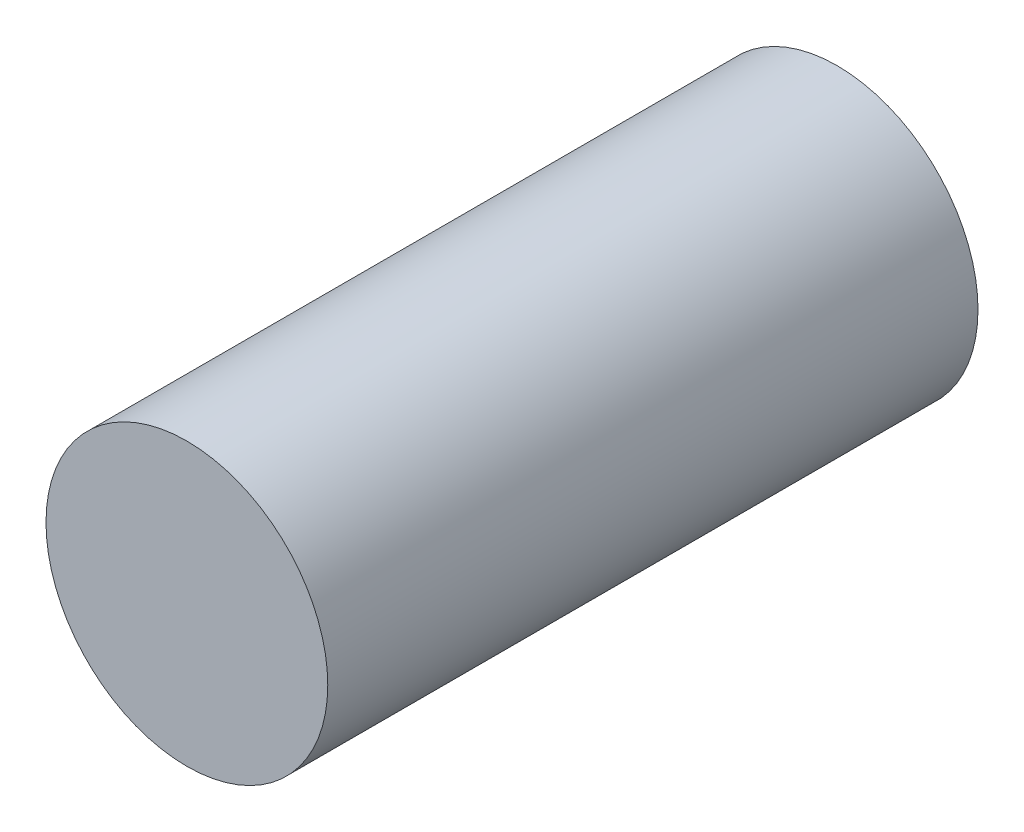
ISO-10303-21;
HEADER;
FILE_DESCRIPTION(('STEP AP214'),'2;1');
FILE_NAME('part.step','',(''),(''),'','','');
FILE_SCHEMA(('AUTOMOTIVE_DESIGN { 1 0 10303 214 1 1 1 1 }'));
ENDSEC;
DATA;
#1=APPLICATION_CONTEXT('core data for automotive mechanical design processes');
#2=APPLICATION_PROTOCOL_DEFINITION('international standard','automotive_design',2000,#1);
#3=PRODUCT_CONTEXT('',#1,'mechanical');
#4=PRODUCT('Part','Part','',(#3));
#5=PRODUCT_RELATED_PRODUCT_CATEGORY('part','',(#4));
#6=PRODUCT_DEFINITION_FORMATION('','',#4);
#7=PRODUCT_DEFINITION_CONTEXT('part definition',#1,'design');
#8=PRODUCT_DEFINITION('design','',#6,#7);
#9=PRODUCT_DEFINITION_SHAPE('','',#8);
#10=(LENGTH_UNIT() NAMED_UNIT(*) SI_UNIT(.MILLI.,.METRE.));
#11=(NAMED_UNIT(*) PLANE_ANGLE_UNIT() SI_UNIT($,.RADIAN.));
#12=(NAMED_UNIT(*) SI_UNIT($,.STERADIAN.) SOLID_ANGLE_UNIT());
#13=UNCERTAINTY_MEASURE_WITH_UNIT(LENGTH_MEASURE(1.E-05),#10,'distance_accuracy_value','');
#14=(GEOMETRIC_REPRESENTATION_CONTEXT(3) GLOBAL_UNCERTAINTY_ASSIGNED_CONTEXT((#13)) GLOBAL_UNIT_ASSIGNED_CONTEXT((#10,
#11,#12)) REPRESENTATION_CONTEXT('',''));
#15=CARTESIAN_POINT('',(0.,0.,0.));
#16=DIRECTION('',(0.,0.,1.));
#17=DIRECTION('',(1.,0.,0.));
#18=AXIS2_PLACEMENT_3D('',#15,#16,#17);
#19=CARTESIAN_POINT('',(0.,0.,150.));
#20=DIRECTION('',(0.,0.,-1.));
#21=DIRECTION('',(-1.,0.,0.));
#22=AXIS2_PLACEMENT_3D('',#19,#20,#21);
#23=CYLINDRICAL_SURFACE('',#22,32.5);
#24=CARTESIAN_POINT('',(0.,0.,150.));
#25=DIRECTION('',(0.,0.,1.));
#26=DIRECTION('',(1.,0.,0.));
#27=AXIS2_PLACEMENT_3D('',#24,#25,#26);
#28=CIRCLE('',#27,32.5);
#29=CARTESIAN_POINT('',(32.5,0.,150.));
#30=VERTEX_POINT('',#29);
#31=EDGE_CURVE('E10',#30,#30,#28,.T.);
#32=ORIENTED_EDGE('',*,*,#31,.F.);
#33=EDGE_LOOP('',(#32));
#34=FACE_BOUND('',#33,.T.);
#35=CARTESIAN_POINT('',(0.,0.,0.));
#36=DIRECTION('',(0.,0.,1.));
#37=DIRECTION('',(1.,0.,0.));
#38=AXIS2_PLACEMENT_3D('',#35,#36,#37);
#39=CIRCLE('',#38,32.5);
#40=CARTESIAN_POINT('',(32.5,0.,0.));
#41=VERTEX_POINT('',#40);
#42=EDGE_CURVE('E40',#41,#41,#39,.T.);
#43=ORIENTED_EDGE('',*,*,#42,.T.);
#44=EDGE_LOOP('',(#43));
#45=FACE_BOUND('',#44,.T.);
#46=ADVANCED_FACE('F37',(#34,#45),#23,.T.);
#47=CARTESIAN_POINT('',(0.,0.,150.));
#48=DIRECTION('',(0.,0.,1.));
#49=DIRECTION('',(1.,0.,0.));
#50=AXIS2_PLACEMENT_3D('',#47,#48,#49);
#51=PLANE('',#50);
#52=ORIENTED_EDGE('',*,*,#31,.T.);
#53=EDGE_LOOP('',(#52));
#54=FACE_BOUND('',#53,.T.);
#55=ADVANCED_FACE('F54',(#54),#51,.T.);
#56=CARTESIAN_POINT('',(0.,0.,0.));
#57=DIRECTION('',(0.,0.,1.));
#58=DIRECTION('',(1.,0.,0.));
#59=AXIS2_PLACEMENT_3D('',#56,#57,#58);
#60=PLANE('',#59);
#61=ORIENTED_EDGE('',*,*,#42,.F.);
#62=EDGE_LOOP('',(#61));
#63=FACE_BOUND('',#62,.T.);
#64=ADVANCED_FACE('F52',(#63),#60,.F.);
#65=CLOSED_SHELL('',(#46,#55,#64));
#66=MANIFOLD_SOLID_BREP('B2',#65);
#67=ADVANCED_BREP_SHAPE_REPRESENTATION('',(#18,#66),#14);
#68=SHAPE_DEFINITION_REPRESENTATION(#9,#67);
ENDSEC;
END-ISO-10303-21;
